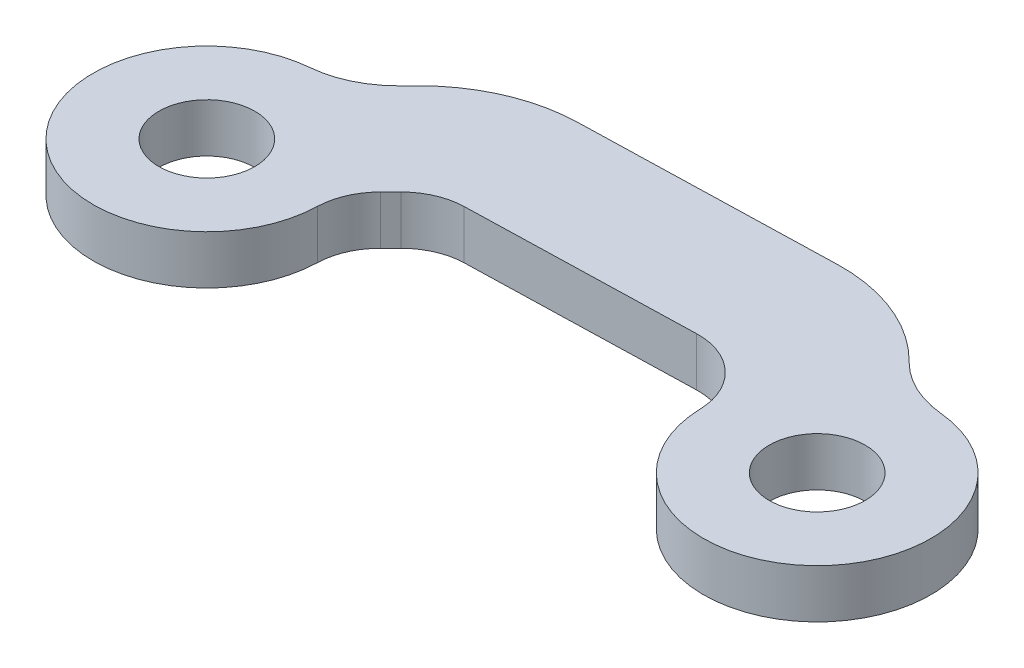
ISO-10303-21;
HEADER;
FILE_DESCRIPTION(('STEP AP214'),'2;1');
FILE_NAME('part.step','',(''),(''),'','','');
FILE_SCHEMA(('AUTOMOTIVE_DESIGN { 1 0 10303 214 1 1 1 1 }'));
ENDSEC;
DATA;
#1=APPLICATION_CONTEXT('core data for automotive mechanical design processes');
#2=APPLICATION_PROTOCOL_DEFINITION('international standard','automotive_design',2000,#1);
#3=PRODUCT_CONTEXT('',#1,'mechanical');
#4=PRODUCT('Part','Part','',(#3));
#5=PRODUCT_RELATED_PRODUCT_CATEGORY('part','',(#4));
#6=PRODUCT_DEFINITION_FORMATION('','',#4);
#7=PRODUCT_DEFINITION_CONTEXT('part definition',#1,'design');
#8=PRODUCT_DEFINITION('design','',#6,#7);
#9=PRODUCT_DEFINITION_SHAPE('','',#8);
#10=(LENGTH_UNIT() NAMED_UNIT(*) SI_UNIT(.MILLI.,.METRE.));
#11=(NAMED_UNIT(*) PLANE_ANGLE_UNIT() SI_UNIT($,.RADIAN.));
#12=(NAMED_UNIT(*) SI_UNIT($,.STERADIAN.) SOLID_ANGLE_UNIT());
#13=UNCERTAINTY_MEASURE_WITH_UNIT(LENGTH_MEASURE(1.E-05),#10,'distance_accuracy_value','');
#14=(GEOMETRIC_REPRESENTATION_CONTEXT(3) GLOBAL_UNCERTAINTY_ASSIGNED_CONTEXT((#13)) GLOBAL_UNIT_ASSIGNED_CONTEXT((#10,
#11,#12)) REPRESENTATION_CONTEXT('',''));
#15=CARTESIAN_POINT('',(0.,0.,0.));
#16=DIRECTION('',(0.,0.,1.));
#17=DIRECTION('',(1.,0.,0.));
#18=AXIS2_PLACEMENT_3D('',#15,#16,#17);
#19=CARTESIAN_POINT('',(27.3663033359232,1.524,-10.3473876844722));
#20=DIRECTION('',(0.,1.,0.));
#21=DIRECTION('',(0.,0.,1.));
#22=AXIS2_PLACEMENT_3D('',#19,#20,#21);
#23=PLANE('',#22);
#24=CARTESIAN_POINT('',(8.18363024694324,1.524,-3.27148882648046));
#25=DIRECTION('',(0.,1.,0.));
#26=DIRECTION('',(0.,0.,1.));
#27=AXIS2_PLACEMENT_3D('',#24,#25,#26);
#28=CIRCLE('',#27,1.5);
#29=CARTESIAN_POINT('',(8.18363024694324,1.524,-4.77148882648046));
#30=VERTEX_POINT('',#29);
#31=EDGE_CURVE('E186',#30,#30,#28,.T.);
#32=ORIENTED_EDGE('',*,*,#31,.F.);
#33=EDGE_LOOP('',(#32));
#34=FACE_BOUND('',#33,.T.);
#35=CARTESIAN_POINT('',(27.3663033359232,1.524,-10.3473876844722));
#36=DIRECTION('',(0.,-1.,0.));
#37=DIRECTION('',(0.,0.,1.));
#38=AXIS2_PLACEMENT_3D('',#35,#36,#37);
#39=CIRCLE('',#38,3.04800000000002);
#40=CARTESIAN_POINT('',(27.0855596173946,1.524,-7.31234452752911));
#41=VERTEX_POINT('',#40);
#42=CARTESIAN_POINT('',(25.2110418668667,1.524,-8.19212621541554));
#43=VERTEX_POINT('',#42);
#44=EDGE_CURVE('E213',#41,#43,#39,.T.);
#45=ORIENTED_EDGE('',*,*,#44,.T.);
#46=DIRECTION('',(-0.707106781186599,0.,-0.707106781186497));
#47=VECTOR('',#46,1.);
#48=CARTESIAN_POINT('',(25.2110418668667,1.524,-8.19212621541554));
#49=LINE('',#48,#47);
#50=CARTESIAN_POINT('',(25.1628637776176,1.524,-8.2403043046646));
#51=VERTEX_POINT('',#50);
#52=EDGE_CURVE('E121',#43,#51,#49,.T.);
#53=ORIENTED_EDGE('',*,*,#52,.T.);
#54=CARTESIAN_POINT('',(21.5707613291899,1.524,-4.64820185623696));
#55=DIRECTION('',(0.,1.,0.));
#56=DIRECTION('',(0.,0.,1.));
#57=AXIS2_PLACEMENT_3D('',#54,#55,#56);
#58=CIRCLE('',#57,5.08);
#59=CARTESIAN_POINT('',(21.4340711041324,1.524,-9.72636252545311));
#60=VERTEX_POINT('',#59);
#61=EDGE_CURVE('E252',#51,#60,#58,.T.);
#62=ORIENTED_EDGE('',*,*,#61,.T.);
#63=DIRECTION('',(-0.999637927011051,0.,0.0269075246176247));
#64=VECTOR('',#63,1.);
#65=CARTESIAN_POINT('',(13.5211826291764,1.524,-9.51336916487402));
#66=LINE('',#65,#64);
#67=CARTESIAN_POINT('',(13.5211826291764,1.524,-9.51336916487402));
#68=VERTEX_POINT('',#67);
#69=EDGE_CURVE('E271',#60,#68,#66,.T.);
#70=ORIENTED_EDGE('',*,*,#69,.T.);
#71=CARTESIAN_POINT('',(13.6578728542339,1.524,-4.4352084956579));
#72=DIRECTION('',(0.,1.,0.));
#73=DIRECTION('',(0.,0.,1.));
#74=AXIS2_PLACEMENT_3D('',#71,#72,#73);
#75=CIRCLE('',#74,5.07999999999998);
#76=CARTESIAN_POINT('',(10.0657704058062,1.524,-8.02731094408551));
#77=VERTEX_POINT('',#76);
#78=EDGE_CURVE('E268',#68,#77,#75,.T.);
#79=ORIENTED_EDGE('',*,*,#78,.T.);
#80=DIRECTION('',(-0.707106781186551,0.,0.707106781186544));
#81=VECTOR('',#80,1.);
#82=CARTESIAN_POINT('',(9.73061365918774,1.524,-7.69215419746708));
#83=LINE('',#82,#81);
#84=CARTESIAN_POINT('',(9.73061365918774,1.524,-7.69215419746708));
#85=VERTEX_POINT('',#84);
#86=EDGE_CURVE('E270',#77,#85,#83,.T.);
#87=ORIENTED_EDGE('',*,*,#86,.T.);
#88=CARTESIAN_POINT('',(7.57535219013115,1.524,-9.84741566652367));
#89=DIRECTION('',(0.,-1.,0.));
#90=DIRECTION('',(0.,0.,-1.));
#91=AXIS2_PLACEMENT_3D('',#88,#89,#90);
#92=CIRCLE('',#91,3.048);
#93=CARTESIAN_POINT('',(7.85609590865981,1.524,-6.81237250958064));
#94=VERTEX_POINT('',#93);
#95=EDGE_CURVE('E273',#85,#94,#92,.T.);
#96=ORIENTED_EDGE('',*,*,#95,.T.);
#97=CARTESIAN_POINT('',(8.18363024694324,1.524,-3.27148882648046));
#98=DIRECTION('',(0.,1.,0.));
#99=DIRECTION('',(0.,0.,1.));
#100=AXIS2_PLACEMENT_3D('',#97,#98,#99);
#101=CIRCLE('',#100,3.55599999999999);
#102=CARTESIAN_POINT('',(11.7381410508802,1.524,-3.16858622838201));
#103=VERTEX_POINT('',#102);
#104=EDGE_CURVE('E279',#94,#103,#101,.T.);
#105=ORIENTED_EDGE('',*,*,#104,.T.);
#106=CARTESIAN_POINT('',(13.7692900817013,1.524,-3.10978474375431));
#107=DIRECTION('',(0.,-1.,0.));
#108=DIRECTION('',(0.,0.,1.));
#109=AXIS2_PLACEMENT_3D('',#106,#107,#108);
#110=CIRCLE('',#109,2.032);
#111=CARTESIAN_POINT('',(12.3324491023302,1.524,-4.54662572312537));
#112=VERTEX_POINT('',#111);
#113=EDGE_CURVE('E281',#103,#112,#110,.T.);
#114=ORIENTED_EDGE('',*,*,#113,.T.);
#115=DIRECTION('',(0.707106781186542,0.,-0.707106781186553));
#116=VECTOR('',#115,1.);
#117=CARTESIAN_POINT('',(12.3324491023303,1.524,-4.54662572312536));
#118=LINE('',#117,#116);
#119=CARTESIAN_POINT('',(12.6531359162588,1.524,-4.86731253705394));
#120=VERTEX_POINT('',#119);
#121=EDGE_CURVE('E283',#112,#120,#118,.T.);
#122=ORIENTED_EDGE('',*,*,#121,.T.);
#123=CARTESIAN_POINT('',(14.0899768956299,1.524,-3.43047155768289));
#124=DIRECTION('',(0.,-1.,0.));
#125=DIRECTION('',(0.,0.,-1.));
#126=AXIS2_PLACEMENT_3D('',#123,#124,#125);
#127=CIRCLE('',#126,2.03199999999999);
#128=CARTESIAN_POINT('',(14.0353008056069,1.524,-5.46173582536933));
#129=VERTEX_POINT('',#128);
#130=EDGE_CURVE('E285',#120,#129,#127,.T.);
#131=ORIENTED_EDGE('',*,*,#130,.T.);
#132=DIRECTION('',(0.999637927011051,0.,-0.0269075246176262));
#133=VECTOR('',#132,1.);
#134=CARTESIAN_POINT('',(14.0353008056069,1.524,-5.46173582536932));
#135=LINE('',#134,#133);
#136=CARTESIAN_POINT('',(21.1066335803084,1.524,-5.65207680341087));
#137=VERTEX_POINT('',#136);
#138=EDGE_CURVE('E287',#129,#137,#135,.T.);
#139=ORIENTED_EDGE('',*,*,#138,.T.);
#140=CARTESIAN_POINT('',(21.1613096703315,1.524,-3.62081253572441));
#141=DIRECTION('',(0.,-1.,0.));
#142=DIRECTION('',(0.,0.,1.));
#143=AXIS2_PLACEMENT_3D('',#140,#141,#142);
#144=CIRCLE('',#143,2.03200000000001);
#145=CARTESIAN_POINT('',(22.5981506497043,1.524,-5.05765351509368));
#146=VERTEX_POINT('',#145);
#147=EDGE_CURVE('E164',#137,#146,#144,.T.);
#148=ORIENTED_EDGE('',*,*,#147,.T.);
#149=DIRECTION('',(0.70710678118566,0.,0.707106781187435));
#150=VECTOR('',#149,1.);
#151=CARTESIAN_POINT('',(22.609206423726,1.524,-5.04659774107199));
#152=LINE('',#151,#150);
#153=CARTESIAN_POINT('',(22.609206423726,1.524,-5.04659774107199));
#154=VERTEX_POINT('',#153);
#155=EDGE_CURVE('E158',#146,#154,#152,.T.);
#156=ORIENTED_EDGE('',*,*,#155,.T.);
#157=CARTESIAN_POINT('',(21.1723654443531,1.524,-3.60975676170275));
#158=DIRECTION('',(0.,-1.,0.));
#159=DIRECTION('',(0.,0.,-1.));
#160=AXIS2_PLACEMENT_3D('',#157,#158,#159);
#161=CIRCLE('',#160,2.032);
#162=CARTESIAN_POINT('',(23.2035144751742,1.524,-3.66855824633044));
#163=VERTEX_POINT('',#162);
#164=EDGE_CURVE('E162',#154,#163,#161,.T.);
#165=ORIENTED_EDGE('',*,*,#164,.T.);
#166=CARTESIAN_POINT('',(26.7580252791112,1.524,-3.77146084442892));
#167=DIRECTION('',(0.,1.,0.));
#168=DIRECTION('',(0.,0.,1.));
#169=AXIS2_PLACEMENT_3D('',#166,#167,#168);
#170=CIRCLE('',#169,3.55599999999999);
#171=EDGE_CURVE('E54',#163,#41,#170,.T.);
#172=ORIENTED_EDGE('',*,*,#171,.T.);
#173=EDGE_LOOP('',(#45,#53,#62,#70,#79,#87,#96,#105,#114,#122,#131,#139,#148,#156,#165,#172));
#174=FACE_BOUND('',#173,.T.);
#175=CARTESIAN_POINT('',(26.7580252791112,1.524,-3.77146084442892));
#176=DIRECTION('',(0.,1.,0.));
#177=DIRECTION('',(0.,0.,1.));
#178=AXIS2_PLACEMENT_3D('',#175,#176,#177);
#179=CIRCLE('',#178,1.5);
#180=CARTESIAN_POINT('',(26.7580252791112,1.524,-5.27146084442892));
#181=VERTEX_POINT('',#180);
#182=EDGE_CURVE('E329',#181,#181,#179,.T.);
#183=ORIENTED_EDGE('',*,*,#182,.F.);
#184=EDGE_LOOP('',(#183));
#185=FACE_BOUND('',#184,.T.);
#186=ADVANCED_FACE('F37',(#34,#174,#185),#23,.T.);
#187=CARTESIAN_POINT('',(27.3663033359232,0.,-10.3473876844722));
#188=DIRECTION('',(0.,1.,0.));
#189=DIRECTION('',(0.,0.,1.));
#190=AXIS2_PLACEMENT_3D('',#187,#188,#189);
#191=PLANE('',#190);
#192=CARTESIAN_POINT('',(27.3663033359232,0.,-10.3473876844722));
#193=DIRECTION('',(0.,-1.,0.));
#194=DIRECTION('',(0.,0.,1.));
#195=AXIS2_PLACEMENT_3D('',#192,#193,#194);
#196=CIRCLE('',#195,3.04800000000002);
#197=CARTESIAN_POINT('',(27.0855596173946,0.,-7.31234452752911));
#198=VERTEX_POINT('',#197);
#199=CARTESIAN_POINT('',(25.2110418668667,0.,-8.19212621541554));
#200=VERTEX_POINT('',#199);
#201=EDGE_CURVE('E182',#198,#200,#196,.T.);
#202=ORIENTED_EDGE('',*,*,#201,.F.);
#203=CARTESIAN_POINT('',(26.7580252791112,0.,-3.77146084442892));
#204=DIRECTION('',(0.,1.,0.));
#205=DIRECTION('',(0.,0.,1.));
#206=AXIS2_PLACEMENT_3D('',#203,#204,#205);
#207=CIRCLE('',#206,3.55599999999999);
#208=CARTESIAN_POINT('',(23.2035144751742,0.,-3.66855824633044));
#209=VERTEX_POINT('',#208);
#210=EDGE_CURVE('E113',#209,#198,#207,.T.);
#211=ORIENTED_EDGE('',*,*,#210,.F.);
#212=CARTESIAN_POINT('',(21.1723654443531,0.,-3.60975676170275));
#213=DIRECTION('',(0.,-1.,0.));
#214=DIRECTION('',(0.,0.,-1.));
#215=AXIS2_PLACEMENT_3D('',#212,#213,#214);
#216=CIRCLE('',#215,2.032);
#217=CARTESIAN_POINT('',(22.609206423726,0.,-5.04659774107199));
#218=VERTEX_POINT('',#217);
#219=EDGE_CURVE('E107',#218,#209,#216,.T.);
#220=ORIENTED_EDGE('',*,*,#219,.F.);
#221=DIRECTION('',(0.70710678118566,0.,0.707106781187435));
#222=VECTOR('',#221,1.);
#223=CARTESIAN_POINT('',(22.609206423726,0.,-5.04659774107199));
#224=LINE('',#223,#222);
#225=CARTESIAN_POINT('',(22.5981506497043,0.,-5.05765351509368));
#226=VERTEX_POINT('',#225);
#227=EDGE_CURVE('E172',#226,#218,#224,.T.);
#228=ORIENTED_EDGE('',*,*,#227,.F.);
#229=CARTESIAN_POINT('',(21.1613096703315,0.,-3.62081253572441));
#230=DIRECTION('',(0.,-1.,0.));
#231=DIRECTION('',(0.,0.,1.));
#232=AXIS2_PLACEMENT_3D('',#229,#230,#231);
#233=CIRCLE('',#232,2.03200000000001);
#234=CARTESIAN_POINT('',(21.1066335803084,0.,-5.65207680341087));
#235=VERTEX_POINT('',#234);
#236=EDGE_CURVE('E208',#235,#226,#233,.T.);
#237=ORIENTED_EDGE('',*,*,#236,.F.);
#238=DIRECTION('',(0.999637927011051,0.,-0.0269075246176262));
#239=VECTOR('',#238,1.);
#240=CARTESIAN_POINT('',(14.0353008056069,0.,-5.46173582536932));
#241=LINE('',#240,#239);
#242=CARTESIAN_POINT('',(14.0353008056069,0.,-5.46173582536933));
#243=VERTEX_POINT('',#242);
#244=EDGE_CURVE('E206',#243,#235,#241,.T.);
#245=ORIENTED_EDGE('',*,*,#244,.F.);
#246=CARTESIAN_POINT('',(14.0899768956299,0.,-3.43047155768289));
#247=DIRECTION('',(0.,-1.,0.));
#248=DIRECTION('',(0.,0.,-1.));
#249=AXIS2_PLACEMENT_3D('',#246,#247,#248);
#250=CIRCLE('',#249,2.03199999999999);
#251=CARTESIAN_POINT('',(12.6531359162588,0.,-4.86731253705394));
#252=VERTEX_POINT('',#251);
#253=EDGE_CURVE('E204',#252,#243,#250,.T.);
#254=ORIENTED_EDGE('',*,*,#253,.F.);
#255=DIRECTION('',(0.707106781186542,0.,-0.707106781186553));
#256=VECTOR('',#255,1.);
#257=CARTESIAN_POINT('',(12.3324491023303,0.,-4.54662572312536));
#258=LINE('',#257,#256);
#259=CARTESIAN_POINT('',(12.3324491023302,0.,-4.54662572312537));
#260=VERTEX_POINT('',#259);
#261=EDGE_CURVE('E202',#260,#252,#258,.T.);
#262=ORIENTED_EDGE('',*,*,#261,.F.);
#263=CARTESIAN_POINT('',(13.7692900817013,0.,-3.10978474375431));
#264=DIRECTION('',(0.,-1.,0.));
#265=DIRECTION('',(0.,0.,1.));
#266=AXIS2_PLACEMENT_3D('',#263,#264,#265);
#267=CIRCLE('',#266,2.032);
#268=CARTESIAN_POINT('',(11.7381410508802,0.,-3.16858622838201));
#269=VERTEX_POINT('',#268);
#270=EDGE_CURVE('E200',#269,#260,#267,.T.);
#271=ORIENTED_EDGE('',*,*,#270,.F.);
#272=CARTESIAN_POINT('',(8.18363024694324,0.,-3.27148882648046));
#273=DIRECTION('',(0.,1.,0.));
#274=DIRECTION('',(0.,0.,1.));
#275=AXIS2_PLACEMENT_3D('',#272,#273,#274);
#276=CIRCLE('',#275,3.55599999999999);
#277=CARTESIAN_POINT('',(7.85609590865981,0.,-6.81237250958064));
#278=VERTEX_POINT('',#277);
#279=EDGE_CURVE('E198',#278,#269,#276,.T.);
#280=ORIENTED_EDGE('',*,*,#279,.F.);
#281=CARTESIAN_POINT('',(7.57535219013115,0.,-9.84741566652367));
#282=DIRECTION('',(0.,-1.,0.));
#283=DIRECTION('',(0.,0.,-1.));
#284=AXIS2_PLACEMENT_3D('',#281,#282,#283);
#285=CIRCLE('',#284,3.048);
#286=CARTESIAN_POINT('',(9.73061365918774,0.,-7.69215419746708));
#287=VERTEX_POINT('',#286);
#288=EDGE_CURVE('E196',#287,#278,#285,.T.);
#289=ORIENTED_EDGE('',*,*,#288,.F.);
#290=DIRECTION('',(-0.707106781186551,0.,0.707106781186544));
#291=VECTOR('',#290,1.);
#292=CARTESIAN_POINT('',(9.73061365918774,0.,-7.69215419746708));
#293=LINE('',#292,#291);
#294=CARTESIAN_POINT('',(10.0657704058062,0.,-8.02731094408551));
#295=VERTEX_POINT('',#294);
#296=EDGE_CURVE('E194',#295,#287,#293,.T.);
#297=ORIENTED_EDGE('',*,*,#296,.F.);
#298=CARTESIAN_POINT('',(13.6578728542339,0.,-4.4352084956579));
#299=DIRECTION('',(0.,1.,0.));
#300=DIRECTION('',(0.,0.,1.));
#301=AXIS2_PLACEMENT_3D('',#298,#299,#300);
#302=CIRCLE('',#301,5.07999999999998);
#303=CARTESIAN_POINT('',(13.5211826291764,0.,-9.51336916487402));
#304=VERTEX_POINT('',#303);
#305=EDGE_CURVE('E192',#304,#295,#302,.T.);
#306=ORIENTED_EDGE('',*,*,#305,.F.);
#307=DIRECTION('',(-0.999637927011051,0.,0.0269075246176247));
#308=VECTOR('',#307,1.);
#309=CARTESIAN_POINT('',(13.5211826291764,0.,-9.51336916487402));
#310=LINE('',#309,#308);
#311=CARTESIAN_POINT('',(21.4340711041324,0.,-9.72636252545311));
#312=VERTEX_POINT('',#311);
#313=EDGE_CURVE('E190',#312,#304,#310,.T.);
#314=ORIENTED_EDGE('',*,*,#313,.F.);
#315=CARTESIAN_POINT('',(21.5707613291899,0.,-4.64820185623696));
#316=DIRECTION('',(0.,1.,0.));
#317=DIRECTION('',(0.,0.,1.));
#318=AXIS2_PLACEMENT_3D('',#315,#316,#317);
#319=CIRCLE('',#318,5.08);
#320=CARTESIAN_POINT('',(25.1628637776176,0.,-8.2403043046646));
#321=VERTEX_POINT('',#320);
#322=EDGE_CURVE('E188',#321,#312,#319,.T.);
#323=ORIENTED_EDGE('',*,*,#322,.F.);
#324=DIRECTION('',(-0.707106781186599,0.,-0.707106781186497));
#325=VECTOR('',#324,1.);
#326=CARTESIAN_POINT('',(25.2110418668667,0.,-8.19212621541554));
#327=LINE('',#326,#325);
#328=EDGE_CURVE('E185',#200,#321,#327,.T.);
#329=ORIENTED_EDGE('',*,*,#328,.F.);
#330=EDGE_LOOP('',(#202,#211,#220,#228,#237,#245,#254,#262,#271,#280,#289,#297,#306,#314,#323,#329));
#331=FACE_BOUND('',#330,.T.);
#332=CARTESIAN_POINT('',(8.18363024694324,0.,-3.27148882648046));
#333=DIRECTION('',(0.,1.,0.));
#334=DIRECTION('',(0.,0.,1.));
#335=AXIS2_PLACEMENT_3D('',#332,#333,#334);
#336=CIRCLE('',#335,1.5);
#337=CARTESIAN_POINT('',(8.18363024694324,0.,-4.77148882648046));
#338=VERTEX_POINT('',#337);
#339=EDGE_CURVE('E335',#338,#338,#336,.T.);
#340=ORIENTED_EDGE('',*,*,#339,.T.);
#341=EDGE_LOOP('',(#340));
#342=FACE_BOUND('',#341,.T.);
#343=CARTESIAN_POINT('',(26.7580252791112,0.,-3.77146084442892));
#344=DIRECTION('',(0.,1.,0.));
#345=DIRECTION('',(0.,0.,1.));
#346=AXIS2_PLACEMENT_3D('',#343,#344,#345);
#347=CIRCLE('',#346,1.5);
#348=CARTESIAN_POINT('',(26.7580252791112,0.,-5.27146084442892));
#349=VERTEX_POINT('',#348);
#350=EDGE_CURVE('E332',#349,#349,#347,.T.);
#351=ORIENTED_EDGE('',*,*,#350,.T.);
#352=EDGE_LOOP('',(#351));
#353=FACE_BOUND('',#352,.T.);
#354=ADVANCED_FACE('F256',(#331,#342,#353),#191,.F.);
#355=CARTESIAN_POINT('',(27.3663033359232,1.524,-10.3473876844722));
#356=DIRECTION('',(0.,-1.,0.));
#357=DIRECTION('',(0.,0.,-1.));
#358=AXIS2_PLACEMENT_3D('',#355,#356,#357);
#359=CYLINDRICAL_SURFACE('',#358,3.04800000000002);
#360=ORIENTED_EDGE('',*,*,#201,.T.);
#361=DIRECTION('',(0.,-1.,0.));
#362=VECTOR('',#361,1.);
#363=CARTESIAN_POINT('',(25.2110418668667,1.524,-8.19212621541554));
#364=LINE('',#363,#362);
#365=EDGE_CURVE('E11',#43,#200,#364,.T.);
#366=ORIENTED_EDGE('',*,*,#365,.F.);
#367=ORIENTED_EDGE('',*,*,#44,.F.);
#368=DIRECTION('',(0.,-1.,0.));
#369=VECTOR('',#368,1.);
#370=CARTESIAN_POINT('',(27.0855596173946,1.524,-7.31234452752911));
#371=LINE('',#370,#369);
#372=EDGE_CURVE('E178',#41,#198,#371,.T.);
#373=ORIENTED_EDGE('',*,*,#372,.T.);
#374=EDGE_LOOP('',(#360,#366,#367,#373));
#375=FACE_BOUND('',#374,.T.);
#376=ADVANCED_FACE('F39',(#375),#359,.F.);
#377=CARTESIAN_POINT('',(25.2110418668667,1.524,-8.19212621541554));
#378=DIRECTION('',(-0.707106781186497,0.,0.707106781186598));
#379=DIRECTION('',(0.707106781186598,0.,0.707106781186497));
#380=AXIS2_PLACEMENT_3D('',#377,#378,#379);
#381=PLANE('',#380);
#382=ORIENTED_EDGE('',*,*,#328,.T.);
#383=DIRECTION('',(0.,-1.,0.));
#384=VECTOR('',#383,1.);
#385=CARTESIAN_POINT('',(25.1628637776176,1.524,-8.2403043046646));
#386=LINE('',#385,#384);
#387=EDGE_CURVE('E46',#51,#321,#386,.T.);
#388=ORIENTED_EDGE('',*,*,#387,.F.);
#389=ORIENTED_EDGE('',*,*,#52,.F.);
#390=ORIENTED_EDGE('',*,*,#365,.T.);
#391=EDGE_LOOP('',(#382,#388,#389,#390));
#392=FACE_BOUND('',#391,.T.);
#393=ADVANCED_FACE('F468',(#392),#381,.F.);
#394=CARTESIAN_POINT('',(21.5707613291899,1.524,-4.64820185623696));
#395=DIRECTION('',(0.,-1.,0.));
#396=DIRECTION('',(0.,0.,-1.));
#397=AXIS2_PLACEMENT_3D('',#394,#395,#396);
#398=CYLINDRICAL_SURFACE('',#397,5.08);
#399=ORIENTED_EDGE('',*,*,#322,.T.);
#400=DIRECTION('',(0.,-1.,0.));
#401=VECTOR('',#400,1.);
#402=CARTESIAN_POINT('',(21.4340711041324,1.524,-9.72636252545311));
#403=LINE('',#402,#401);
#404=EDGE_CURVE('E244',#60,#312,#403,.T.);
#405=ORIENTED_EDGE('',*,*,#404,.F.);
#406=ORIENTED_EDGE('',*,*,#61,.F.);
#407=ORIENTED_EDGE('',*,*,#387,.T.);
#408=EDGE_LOOP('',(#399,#405,#406,#407));
#409=FACE_BOUND('',#408,.T.);
#410=ADVANCED_FACE('F250',(#409),#398,.T.);
#411=CARTESIAN_POINT('',(13.5211826291764,1.524,-9.51336916487402));
#412=DIRECTION('',(0.0269075246176247,0.,0.999637927011051));
#413=DIRECTION('',(0.999637927011051,0.,-0.0269075246176247));
#414=AXIS2_PLACEMENT_3D('',#411,#412,#413);
#415=PLANE('',#414);
#416=ORIENTED_EDGE('',*,*,#313,.T.);
#417=DIRECTION('',(0.,-1.,0.));
#418=VECTOR('',#417,1.);
#419=CARTESIAN_POINT('',(13.5211826291764,1.524,-9.51336916487402));
#420=LINE('',#419,#418);
#421=EDGE_CURVE('E241',#68,#304,#420,.T.);
#422=ORIENTED_EDGE('',*,*,#421,.F.);
#423=ORIENTED_EDGE('',*,*,#69,.F.);
#424=ORIENTED_EDGE('',*,*,#404,.T.);
#425=EDGE_LOOP('',(#416,#422,#423,#424));
#426=FACE_BOUND('',#425,.T.);
#427=ADVANCED_FACE('F262',(#426),#415,.F.);
#428=CARTESIAN_POINT('',(13.6578728542339,1.524,-4.4352084956579));
#429=DIRECTION('',(0.,-1.,0.));
#430=DIRECTION('',(0.,0.,-1.));
#431=AXIS2_PLACEMENT_3D('',#428,#429,#430);
#432=CYLINDRICAL_SURFACE('',#431,5.07999999999998);
#433=ORIENTED_EDGE('',*,*,#305,.T.);
#434=DIRECTION('',(0.,-1.,0.));
#435=VECTOR('',#434,1.);
#436=CARTESIAN_POINT('',(10.0657704058062,1.524,-8.02731094408551));
#437=LINE('',#436,#435);
#438=EDGE_CURVE('E238',#77,#295,#437,.T.);
#439=ORIENTED_EDGE('',*,*,#438,.F.);
#440=ORIENTED_EDGE('',*,*,#78,.F.);
#441=ORIENTED_EDGE('',*,*,#421,.T.);
#442=EDGE_LOOP('',(#433,#439,#440,#441));
#443=FACE_BOUND('',#442,.T.);
#444=ADVANCED_FACE('F266',(#443),#432,.T.);
#445=CARTESIAN_POINT('',(9.73061365918774,1.524,-7.69215419746708));
#446=DIRECTION('',(0.707106781186544,0.,0.707106781186551));
#447=DIRECTION('',(0.707106781186551,0.,-0.707106781186544));
#448=AXIS2_PLACEMENT_3D('',#445,#446,#447);
#449=PLANE('',#448);
#450=ORIENTED_EDGE('',*,*,#296,.T.);
#451=DIRECTION('',(0.,-1.,0.));
#452=VECTOR('',#451,1.);
#453=CARTESIAN_POINT('',(9.73061365918774,1.524,-7.69215419746708));
#454=LINE('',#453,#452);
#455=EDGE_CURVE('E235',#85,#287,#454,.T.);
#456=ORIENTED_EDGE('',*,*,#455,.F.);
#457=ORIENTED_EDGE('',*,*,#86,.F.);
#458=ORIENTED_EDGE('',*,*,#438,.T.);
#459=EDGE_LOOP('',(#450,#456,#457,#458));
#460=FACE_BOUND('',#459,.T.);
#461=ADVANCED_FACE('F433',(#460),#449,.F.);
#462=CARTESIAN_POINT('',(7.57535219013115,1.524,-9.84741566652367));
#463=DIRECTION('',(0.,-1.,0.));
#464=DIRECTION('',(0.,0.,-1.));
#465=AXIS2_PLACEMENT_3D('',#462,#463,#464);
#466=CYLINDRICAL_SURFACE('',#465,3.048);
#467=ORIENTED_EDGE('',*,*,#288,.T.);
#468=DIRECTION('',(0.,-1.,0.));
#469=VECTOR('',#468,1.);
#470=CARTESIAN_POINT('',(7.85609590865981,1.524,-6.81237250958064));
#471=LINE('',#470,#469);
#472=EDGE_CURVE('E232',#94,#278,#471,.T.);
#473=ORIENTED_EDGE('',*,*,#472,.F.);
#474=ORIENTED_EDGE('',*,*,#95,.F.);
#475=ORIENTED_EDGE('',*,*,#455,.T.);
#476=EDGE_LOOP('',(#467,#473,#474,#475));
#477=FACE_BOUND('',#476,.T.);
#478=ADVANCED_FACE('F423',(#477),#466,.F.);
#479=CARTESIAN_POINT('',(8.18363024694324,1.524,-3.27148882648046));
#480=DIRECTION('',(0.,-1.,0.));
#481=DIRECTION('',(0.,0.,-1.));
#482=AXIS2_PLACEMENT_3D('',#479,#480,#481);
#483=CYLINDRICAL_SURFACE('',#482,3.55599999999999);
#484=ORIENTED_EDGE('',*,*,#279,.T.);
#485=DIRECTION('',(0.,-1.,0.));
#486=VECTOR('',#485,1.);
#487=CARTESIAN_POINT('',(11.7381410508802,1.524,-3.16858622838201));
#488=LINE('',#487,#486);
#489=EDGE_CURVE('E229',#103,#269,#488,.T.);
#490=ORIENTED_EDGE('',*,*,#489,.F.);
#491=ORIENTED_EDGE('',*,*,#104,.F.);
#492=ORIENTED_EDGE('',*,*,#472,.T.);
#493=EDGE_LOOP('',(#484,#490,#491,#492));
#494=FACE_BOUND('',#493,.T.);
#495=ADVANCED_FACE('F413',(#494),#483,.T.);
#496=CARTESIAN_POINT('',(13.7692900817013,1.524,-3.10978474375431));
#497=DIRECTION('',(0.,-1.,0.));
#498=DIRECTION('',(0.,0.,-1.));
#499=AXIS2_PLACEMENT_3D('',#496,#497,#498);
#500=CYLINDRICAL_SURFACE('',#499,2.032);
#501=ORIENTED_EDGE('',*,*,#270,.T.);
#502=DIRECTION('',(0.,-1.,0.));
#503=VECTOR('',#502,1.);
#504=CARTESIAN_POINT('',(12.3324491023302,1.524,-4.54662572312537));
#505=LINE('',#504,#503);
#506=EDGE_CURVE('E226',#112,#260,#505,.T.);
#507=ORIENTED_EDGE('',*,*,#506,.F.);
#508=ORIENTED_EDGE('',*,*,#113,.F.);
#509=ORIENTED_EDGE('',*,*,#489,.T.);
#510=EDGE_LOOP('',(#501,#507,#508,#509));
#511=FACE_BOUND('',#510,.T.);
#512=ADVANCED_FACE('F403',(#511),#500,.F.);
#513=CARTESIAN_POINT('',(12.3324491023303,1.524,-4.54662572312536));
#514=DIRECTION('',(-0.707106781186553,0.,-0.707106781186542));
#515=DIRECTION('',(-0.707106781186542,0.,0.707106781186553));
#516=AXIS2_PLACEMENT_3D('',#513,#514,#515);
#517=PLANE('',#516);
#518=ORIENTED_EDGE('',*,*,#261,.T.);
#519=DIRECTION('',(0.,-1.,0.));
#520=VECTOR('',#519,1.);
#521=CARTESIAN_POINT('',(12.6531359162588,1.524,-4.86731253705394));
#522=LINE('',#521,#520);
#523=EDGE_CURVE('E223',#120,#252,#522,.T.);
#524=ORIENTED_EDGE('',*,*,#523,.F.);
#525=ORIENTED_EDGE('',*,*,#121,.F.);
#526=ORIENTED_EDGE('',*,*,#506,.T.);
#527=EDGE_LOOP('',(#518,#524,#525,#526));
#528=FACE_BOUND('',#527,.T.);
#529=ADVANCED_FACE('F393',(#528),#517,.F.);
#530=CARTESIAN_POINT('',(14.0899768956299,1.524,-3.43047155768289));
#531=DIRECTION('',(0.,-1.,0.));
#532=DIRECTION('',(0.,0.,-1.));
#533=AXIS2_PLACEMENT_3D('',#530,#531,#532);
#534=CYLINDRICAL_SURFACE('',#533,2.03199999999999);
#535=ORIENTED_EDGE('',*,*,#253,.T.);
#536=DIRECTION('',(0.,-1.,0.));
#537=VECTOR('',#536,1.);
#538=CARTESIAN_POINT('',(14.0353008056069,1.524,-5.46173582536933));
#539=LINE('',#538,#537);
#540=EDGE_CURVE('E220',#129,#243,#539,.T.);
#541=ORIENTED_EDGE('',*,*,#540,.F.);
#542=ORIENTED_EDGE('',*,*,#130,.F.);
#543=ORIENTED_EDGE('',*,*,#523,.T.);
#544=EDGE_LOOP('',(#535,#541,#542,#543));
#545=FACE_BOUND('',#544,.T.);
#546=ADVANCED_FACE('F384',(#545),#534,.F.);
#547=CARTESIAN_POINT('',(14.0353008056069,1.524,-5.46173582536932));
#548=DIRECTION('',(-0.0269075246176262,0.,-0.999637927011051));
#549=DIRECTION('',(-0.999637927011051,0.,0.0269075246176262));
#550=AXIS2_PLACEMENT_3D('',#547,#548,#549);
#551=PLANE('',#550);
#552=ORIENTED_EDGE('',*,*,#244,.T.);
#553=DIRECTION('',(0.,-1.,0.));
#554=VECTOR('',#553,1.);
#555=CARTESIAN_POINT('',(21.1066335803084,1.524,-5.65207680341087));
#556=LINE('',#555,#554);
#557=EDGE_CURVE('E217',#137,#235,#556,.T.);
#558=ORIENTED_EDGE('',*,*,#557,.F.);
#559=ORIENTED_EDGE('',*,*,#138,.F.);
#560=ORIENTED_EDGE('',*,*,#540,.T.);
#561=EDGE_LOOP('',(#552,#558,#559,#560));
#562=FACE_BOUND('',#561,.T.);
#563=ADVANCED_FACE('F293',(#562),#551,.F.);
#564=CARTESIAN_POINT('',(21.1613096703315,1.524,-3.62081253572441));
#565=DIRECTION('',(0.,-1.,0.));
#566=DIRECTION('',(0.,0.,-1.));
#567=AXIS2_PLACEMENT_3D('',#564,#565,#566);
#568=CYLINDRICAL_SURFACE('',#567,2.03200000000001);
#569=ORIENTED_EDGE('',*,*,#236,.T.);
#570=DIRECTION('',(0.,-1.,0.));
#571=VECTOR('',#570,1.);
#572=CARTESIAN_POINT('',(22.5981506497043,1.524,-5.05765351509368));
#573=LINE('',#572,#571);
#574=EDGE_CURVE('E173',#146,#226,#573,.T.);
#575=ORIENTED_EDGE('',*,*,#574,.F.);
#576=ORIENTED_EDGE('',*,*,#147,.F.);
#577=ORIENTED_EDGE('',*,*,#557,.T.);
#578=EDGE_LOOP('',(#569,#575,#576,#577));
#579=FACE_BOUND('',#578,.T.);
#580=ADVANCED_FACE('F297',(#579),#568,.F.);
#581=CARTESIAN_POINT('',(22.609206423726,1.524,-5.04659774107199));
#582=DIRECTION('',(0.707106781187435,0.,-0.70710678118566));
#583=DIRECTION('',(-0.70710678118566,0.,-0.707106781187435));
#584=AXIS2_PLACEMENT_3D('',#581,#582,#583);
#585=PLANE('',#584);
#586=ORIENTED_EDGE('',*,*,#227,.T.);
#587=DIRECTION('',(0.,-1.,0.));
#588=VECTOR('',#587,1.);
#589=CARTESIAN_POINT('',(22.609206423726,1.524,-5.04659774107199));
#590=LINE('',#589,#588);
#591=EDGE_CURVE('E169',#154,#218,#590,.T.);
#592=ORIENTED_EDGE('',*,*,#591,.F.);
#593=ORIENTED_EDGE('',*,*,#155,.F.);
#594=ORIENTED_EDGE('',*,*,#574,.T.);
#595=EDGE_LOOP('',(#586,#592,#593,#594));
#596=FACE_BOUND('',#595,.T.);
#597=ADVANCED_FACE('F170',(#596),#585,.F.);
#598=CARTESIAN_POINT('',(21.1723654443531,1.524,-3.60975676170275));
#599=DIRECTION('',(0.,-1.,0.));
#600=DIRECTION('',(0.,0.,-1.));
#601=AXIS2_PLACEMENT_3D('',#598,#599,#600);
#602=CYLINDRICAL_SURFACE('',#601,2.032);
#603=ORIENTED_EDGE('',*,*,#219,.T.);
#604=DIRECTION('',(0.,-1.,0.));
#605=VECTOR('',#604,1.);
#606=CARTESIAN_POINT('',(23.2035144751742,1.524,-3.66855824633044));
#607=LINE('',#606,#605);
#608=EDGE_CURVE('E174',#163,#209,#607,.T.);
#609=ORIENTED_EDGE('',*,*,#608,.F.);
#610=ORIENTED_EDGE('',*,*,#164,.F.);
#611=ORIENTED_EDGE('',*,*,#591,.T.);
#612=EDGE_LOOP('',(#603,#609,#610,#611));
#613=FACE_BOUND('',#612,.T.);
#614=ADVANCED_FACE('F176',(#613),#602,.F.);
#615=CARTESIAN_POINT('',(26.7580252791112,1.524,-3.77146084442892));
#616=DIRECTION('',(0.,-1.,0.));
#617=DIRECTION('',(0.,0.,-1.));
#618=AXIS2_PLACEMENT_3D('',#615,#616,#617);
#619=CYLINDRICAL_SURFACE('',#618,3.55599999999999);
#620=ORIENTED_EDGE('',*,*,#210,.T.);
#621=ORIENTED_EDGE('',*,*,#372,.F.);
#622=ORIENTED_EDGE('',*,*,#171,.F.);
#623=ORIENTED_EDGE('',*,*,#608,.T.);
#624=EDGE_LOOP('',(#620,#621,#622,#623));
#625=FACE_BOUND('',#624,.T.);
#626=ADVANCED_FACE('F301',(#625),#619,.T.);
#627=CARTESIAN_POINT('',(8.18363024694324,1.524,-3.27148882648046));
#628=DIRECTION('',(0.,-1.,0.));
#629=DIRECTION('',(0.,0.,-1.));
#630=AXIS2_PLACEMENT_3D('',#627,#628,#629);
#631=CYLINDRICAL_SURFACE('',#630,1.5);
#632=CARTESIAN_POINT('',(8.18363024694324,1.524,-4.77148882648046));
#633=CARTESIAN_POINT('',(8.18363024694324,1.508125,-4.77148882648046));
#634=CARTESIAN_POINT('',(8.18363024694324,1.49225,-4.77148882648046));
#635=CARTESIAN_POINT('',(8.18363024694324,1.4605,-4.77148882648046));
#636=CARTESIAN_POINT('',(8.18363024694324,1.444625,-4.77148882648046));
#637=CARTESIAN_POINT('',(8.18363024694324,1.412875,-4.77148882648046));
#638=CARTESIAN_POINT('',(8.18363024694324,1.397,-4.77148882648046));
#639=CARTESIAN_POINT('',(8.18363024694324,1.36525,-4.77148882648046));
#640=CARTESIAN_POINT('',(8.18363024694324,1.349375,-4.77148882648046));
#641=CARTESIAN_POINT('',(8.18363024694324,1.317625,-4.77148882648046));
#642=CARTESIAN_POINT('',(8.18363024694324,1.30175,-4.77148882648046));
#643=CARTESIAN_POINT('',(8.18363024694324,1.27,-4.77148882648046));
#644=CARTESIAN_POINT('',(8.18363024694324,1.254125,-4.77148882648046));
#645=CARTESIAN_POINT('',(8.18363024694324,1.222375,-4.77148882648046));
#646=CARTESIAN_POINT('',(8.18363024694324,1.2065,-4.77148882648046));
#647=CARTESIAN_POINT('',(8.18363024694324,1.17475,-4.77148882648046));
#648=CARTESIAN_POINT('',(8.18363024694324,1.158875,-4.77148882648046));
#649=CARTESIAN_POINT('',(8.18363024694324,1.127125,-4.77148882648046));
#650=CARTESIAN_POINT('',(8.18363024694324,1.11125,-4.77148882648046));
#651=CARTESIAN_POINT('',(8.18363024694324,1.0795,-4.77148882648046));
#652=CARTESIAN_POINT('',(8.18363024694324,1.063625,-4.77148882648046));
#653=CARTESIAN_POINT('',(8.18363024694324,1.031875,-4.77148882648046));
#654=CARTESIAN_POINT('',(8.18363024694324,1.016,-4.77148882648046));
#655=CARTESIAN_POINT('',(8.18363024694324,0.98425,-4.77148882648046));
#656=CARTESIAN_POINT('',(8.18363024694324,0.968375,-4.77148882648046));
#657=CARTESIAN_POINT('',(8.18363024694324,0.936625,-4.77148882648046));
#658=CARTESIAN_POINT('',(8.18363024694324,0.92075,-4.77148882648046));
#659=CARTESIAN_POINT('',(8.18363024694324,0.889,-4.77148882648046));
#660=CARTESIAN_POINT('',(8.18363024694324,0.873125,-4.77148882648046));
#661=CARTESIAN_POINT('',(8.18363024694324,0.841375,-4.77148882648046));
#662=CARTESIAN_POINT('',(8.18363024694324,0.8255,-4.77148882648046));
#663=CARTESIAN_POINT('',(8.18363024694324,0.79375,-4.77148882648046));
#664=CARTESIAN_POINT('',(8.18363024694324,0.777875,-4.77148882648046));
#665=CARTESIAN_POINT('',(8.18363024694324,0.746125,-4.77148882648046));
#666=CARTESIAN_POINT('',(8.18363024694324,0.73025,-4.77148882648046));
#667=CARTESIAN_POINT('',(8.18363024694324,0.6985,-4.77148882648046));
#668=CARTESIAN_POINT('',(8.18363024694324,0.682625,-4.77148882648046));
#669=CARTESIAN_POINT('',(8.18363024694324,0.650875,-4.77148882648046));
#670=CARTESIAN_POINT('',(8.18363024694324,0.635,-4.77148882648046));
#671=CARTESIAN_POINT('',(8.18363024694324,0.60325,-4.77148882648046));
#672=CARTESIAN_POINT('',(8.18363024694324,0.587375,-4.77148882648046));
#673=CARTESIAN_POINT('',(8.18363024694324,0.555625,-4.77148882648046));
#674=CARTESIAN_POINT('',(8.18363024694324,0.53975,-4.77148882648046));
#675=CARTESIAN_POINT('',(8.18363024694324,0.508,-4.77148882648046));
#676=CARTESIAN_POINT('',(8.18363024694324,0.492125,-4.77148882648046));
#677=CARTESIAN_POINT('',(8.18363024694324,0.460375,-4.77148882648046));
#678=CARTESIAN_POINT('',(8.18363024694324,0.4445,-4.77148882648046));
#679=CARTESIAN_POINT('',(8.18363024694324,0.41275,-4.77148882648046));
#680=CARTESIAN_POINT('',(8.18363024694324,0.396875,-4.77148882648046));
#681=CARTESIAN_POINT('',(8.18363024694324,0.365125,-4.77148882648046));
#682=CARTESIAN_POINT('',(8.18363024694324,0.34925,-4.77148882648046));
#683=CARTESIAN_POINT('',(8.18363024694324,0.3175,-4.77148882648046));
#684=CARTESIAN_POINT('',(8.18363024694324,0.301625,-4.77148882648046));
#685=CARTESIAN_POINT('',(8.18363024694324,0.269875,-4.77148882648046));
#686=CARTESIAN_POINT('',(8.18363024694324,0.254,-4.77148882648046));
#687=CARTESIAN_POINT('',(8.18363024694324,0.22225,-4.77148882648046));
#688=CARTESIAN_POINT('',(8.18363024694324,0.206375,-4.77148882648046));
#689=CARTESIAN_POINT('',(8.18363024694324,0.174625,-4.77148882648046));
#690=CARTESIAN_POINT('',(8.18363024694324,0.15875,-4.77148882648046));
#691=CARTESIAN_POINT('',(8.18363024694324,0.127,-4.77148882648046));
#692=CARTESIAN_POINT('',(8.18363024694324,0.111125,-4.77148882648046));
#693=CARTESIAN_POINT('',(8.18363024694324,0.079375,-4.77148882648046));
#694=CARTESIAN_POINT('',(8.18363024694324,0.0635,-4.77148882648046));
#695=CARTESIAN_POINT('',(8.18363024694324,0.0317499999999999,-4.77148882648046));
#696=CARTESIAN_POINT('',(8.18363024694324,0.015875,-4.77148882648046));
#697=CARTESIAN_POINT('',(8.18363024694324,0.,-4.77148882648046));
#698=B_SPLINE_CURVE_WITH_KNOTS('',3,(#632,#633,#634,#635,#636,#637,#638,#639,#640,#641,#642,
#643,#644,#645,#646,#647,#648,#649,#650,#651,#652,#653,#654,#655,#656,#657,#658,#659,#660,#661,
#662,#663,#664,#665,#666,#667,#668,#669,#670,#671,#672,#673,#674,#675,#676,#677,#678,#679,#680,
#681,#682,#683,#684,#685,#686,#687,#688,#689,#690,#691,#692,#693,#694,#695,#696,#697),
.UNSPECIFIED.,.F.,.F.,(4,2,2,2,2,2,2,2,2,2,2,2,2,2,2,2,2,2,2,2,2,2,2,2,2,2,2,2,2,2,2,2,4),(0.,
0.0476249999999999,0.0952499999999998,0.142875,0.1905,0.238125,0.28575,0.333375,0.381,0.428625,
0.47625,0.523875,0.5715,0.619125,0.66675,0.714375,0.762,0.809625,0.85725,0.904875,0.9525,
1.000125,1.04775,1.095375,1.143,1.190625,1.23825,1.285875,1.3335,1.381125,1.42875,1.476375,
1.524),.UNSPECIFIED.);
#699=EDGE_CURVE('BSEAM303',#30,#338,#698,.T.);
#700=ORIENTED_EDGE('',*,*,#31,.T.);
#701=ORIENTED_EDGE('',*,*,#339,.F.);
#702=ORIENTED_EDGE('',*,*,#699,.T.);
#703=ORIENTED_EDGE('',*,*,#699,.F.);
#704=EDGE_LOOP('',(#700,#702,#701,#703));
#705=FACE_BOUND('',#704,.T.);
#706=ADVANCED_FACE('F303',(#705),#631,.F.);
#707=CARTESIAN_POINT('',(26.7580252791112,1.524,-3.77146084442892));
#708=DIRECTION('',(0.,-1.,0.));
#709=DIRECTION('',(0.,0.,-1.));
#710=AXIS2_PLACEMENT_3D('',#707,#708,#709);
#711=CYLINDRICAL_SURFACE('',#710,1.5);
#712=CARTESIAN_POINT('',(26.7580252791112,1.524,-5.27146084442892));
#713=CARTESIAN_POINT('',(26.7580252791112,1.508125,-5.27146084442892));
#714=CARTESIAN_POINT('',(26.7580252791112,1.49225,-5.27146084442892));
#715=CARTESIAN_POINT('',(26.7580252791112,1.4605,-5.27146084442892));
#716=CARTESIAN_POINT('',(26.7580252791112,1.444625,-5.27146084442892));
#717=CARTESIAN_POINT('',(26.7580252791112,1.412875,-5.27146084442892));
#718=CARTESIAN_POINT('',(26.7580252791112,1.397,-5.27146084442892));
#719=CARTESIAN_POINT('',(26.7580252791112,1.36525,-5.27146084442892));
#720=CARTESIAN_POINT('',(26.7580252791112,1.349375,-5.27146084442892));
#721=CARTESIAN_POINT('',(26.7580252791112,1.317625,-5.27146084442892));
#722=CARTESIAN_POINT('',(26.7580252791112,1.30175,-5.27146084442892));
#723=CARTESIAN_POINT('',(26.7580252791112,1.27,-5.27146084442892));
#724=CARTESIAN_POINT('',(26.7580252791112,1.254125,-5.27146084442892));
#725=CARTESIAN_POINT('',(26.7580252791112,1.222375,-5.27146084442892));
#726=CARTESIAN_POINT('',(26.7580252791112,1.2065,-5.27146084442892));
#727=CARTESIAN_POINT('',(26.7580252791112,1.17475,-5.27146084442892));
#728=CARTESIAN_POINT('',(26.7580252791112,1.158875,-5.27146084442892));
#729=CARTESIAN_POINT('',(26.7580252791112,1.127125,-5.27146084442892));
#730=CARTESIAN_POINT('',(26.7580252791112,1.11125,-5.27146084442892));
#731=CARTESIAN_POINT('',(26.7580252791112,1.0795,-5.27146084442892));
#732=CARTESIAN_POINT('',(26.7580252791112,1.063625,-5.27146084442892));
#733=CARTESIAN_POINT('',(26.7580252791112,1.031875,-5.27146084442892));
#734=CARTESIAN_POINT('',(26.7580252791112,1.016,-5.27146084442892));
#735=CARTESIAN_POINT('',(26.7580252791112,0.98425,-5.27146084442892));
#736=CARTESIAN_POINT('',(26.7580252791112,0.968375,-5.27146084442892));
#737=CARTESIAN_POINT('',(26.7580252791112,0.936625,-5.27146084442892));
#738=CARTESIAN_POINT('',(26.7580252791112,0.92075,-5.27146084442892));
#739=CARTESIAN_POINT('',(26.7580252791112,0.889,-5.27146084442892));
#740=CARTESIAN_POINT('',(26.7580252791112,0.873125,-5.27146084442892));
#741=CARTESIAN_POINT('',(26.7580252791112,0.841375,-5.27146084442892));
#742=CARTESIAN_POINT('',(26.7580252791112,0.8255,-5.27146084442892));
#743=CARTESIAN_POINT('',(26.7580252791112,0.79375,-5.27146084442892));
#744=CARTESIAN_POINT('',(26.7580252791112,0.777875,-5.27146084442892));
#745=CARTESIAN_POINT('',(26.7580252791112,0.746125,-5.27146084442892));
#746=CARTESIAN_POINT('',(26.7580252791112,0.73025,-5.27146084442892));
#747=CARTESIAN_POINT('',(26.7580252791112,0.6985,-5.27146084442892));
#748=CARTESIAN_POINT('',(26.7580252791112,0.682625,-5.27146084442892));
#749=CARTESIAN_POINT('',(26.7580252791112,0.650875,-5.27146084442892));
#750=CARTESIAN_POINT('',(26.7580252791112,0.635,-5.27146084442892));
#751=CARTESIAN_POINT('',(26.7580252791112,0.60325,-5.27146084442892));
#752=CARTESIAN_POINT('',(26.7580252791112,0.587375,-5.27146084442892));
#753=CARTESIAN_POINT('',(26.7580252791112,0.555625,-5.27146084442892));
#754=CARTESIAN_POINT('',(26.7580252791112,0.53975,-5.27146084442892));
#755=CARTESIAN_POINT('',(26.7580252791112,0.508,-5.27146084442892));
#756=CARTESIAN_POINT('',(26.7580252791112,0.492125,-5.27146084442892));
#757=CARTESIAN_POINT('',(26.7580252791112,0.460375,-5.27146084442892));
#758=CARTESIAN_POINT('',(26.7580252791112,0.4445,-5.27146084442892));
#759=CARTESIAN_POINT('',(26.7580252791112,0.41275,-5.27146084442892));
#760=CARTESIAN_POINT('',(26.7580252791112,0.396875,-5.27146084442892));
#761=CARTESIAN_POINT('',(26.7580252791112,0.365125,-5.27146084442892));
#762=CARTESIAN_POINT('',(26.7580252791112,0.34925,-5.27146084442892));
#763=CARTESIAN_POINT('',(26.7580252791112,0.3175,-5.27146084442892));
#764=CARTESIAN_POINT('',(26.7580252791112,0.301625,-5.27146084442892));
#765=CARTESIAN_POINT('',(26.7580252791112,0.269875,-5.27146084442892));
#766=CARTESIAN_POINT('',(26.7580252791112,0.254,-5.27146084442892));
#767=CARTESIAN_POINT('',(26.7580252791112,0.22225,-5.27146084442892));
#768=CARTESIAN_POINT('',(26.7580252791112,0.206375,-5.27146084442892));
#769=CARTESIAN_POINT('',(26.7580252791112,0.174625,-5.27146084442892));
#770=CARTESIAN_POINT('',(26.7580252791112,0.15875,-5.27146084442892));
#771=CARTESIAN_POINT('',(26.7580252791112,0.127,-5.27146084442892));
#772=CARTESIAN_POINT('',(26.7580252791112,0.111125,-5.27146084442892));
#773=CARTESIAN_POINT('',(26.7580252791112,0.079375,-5.27146084442892));
#774=CARTESIAN_POINT('',(26.7580252791112,0.0635,-5.27146084442892));
#775=CARTESIAN_POINT('',(26.7580252791112,0.0317499999999999,-5.27146084442892));
#776=CARTESIAN_POINT('',(26.7580252791112,0.015875,-5.27146084442892));
#777=CARTESIAN_POINT('',(26.7580252791112,0.,-5.27146084442892));
#778=B_SPLINE_CURVE_WITH_KNOTS('',3,(#712,#713,#714,#715,#716,#717,#718,#719,#720,#721,#722,
#723,#724,#725,#726,#727,#728,#729,#730,#731,#732,#733,#734,#735,#736,#737,#738,#739,#740,#741,
#742,#743,#744,#745,#746,#747,#748,#749,#750,#751,#752,#753,#754,#755,#756,#757,#758,#759,#760,
#761,#762,#763,#764,#765,#766,#767,#768,#769,#770,#771,#772,#773,#774,#775,#776,#777),
.UNSPECIFIED.,.F.,.F.,(4,2,2,2,2,2,2,2,2,2,2,2,2,2,2,2,2,2,2,2,2,2,2,2,2,2,2,2,2,2,2,2,4),(0.,
0.0476249999999999,0.0952499999999998,0.142875,0.1905,0.238125,0.28575,0.333375,0.381,0.428625,
0.47625,0.523875,0.5715,0.619125,0.66675,0.714375,0.762,0.809625,0.85725,0.904875,0.9525,
1.000125,1.04775,1.095375,1.143,1.190625,1.23825,1.285875,1.3335,1.381125,1.42875,1.476375,
1.524),.UNSPECIFIED.);
#779=EDGE_CURVE('BSEAM309',#181,#349,#778,.T.);
#780=ORIENTED_EDGE('',*,*,#182,.T.);
#781=ORIENTED_EDGE('',*,*,#350,.F.);
#782=ORIENTED_EDGE('',*,*,#779,.T.);
#783=ORIENTED_EDGE('',*,*,#779,.F.);
#784=EDGE_LOOP('',(#780,#782,#781,#783));
#785=FACE_BOUND('',#784,.T.);
#786=ADVANCED_FACE('F309',(#785),#711,.F.);
#787=CLOSED_SHELL('',(#186,#354,#376,#393,#410,#427,#444,#461,#478,#495,#512,#529,#546,#563,
#580,#597,#614,#626,#706,#786));
#788=MANIFOLD_SOLID_BREP('B2',#787);
#789=ADVANCED_BREP_SHAPE_REPRESENTATION('',(#18,#788),#14);
#790=SHAPE_DEFINITION_REPRESENTATION(#9,#789);
ENDSEC;
END-ISO-10303-21;
